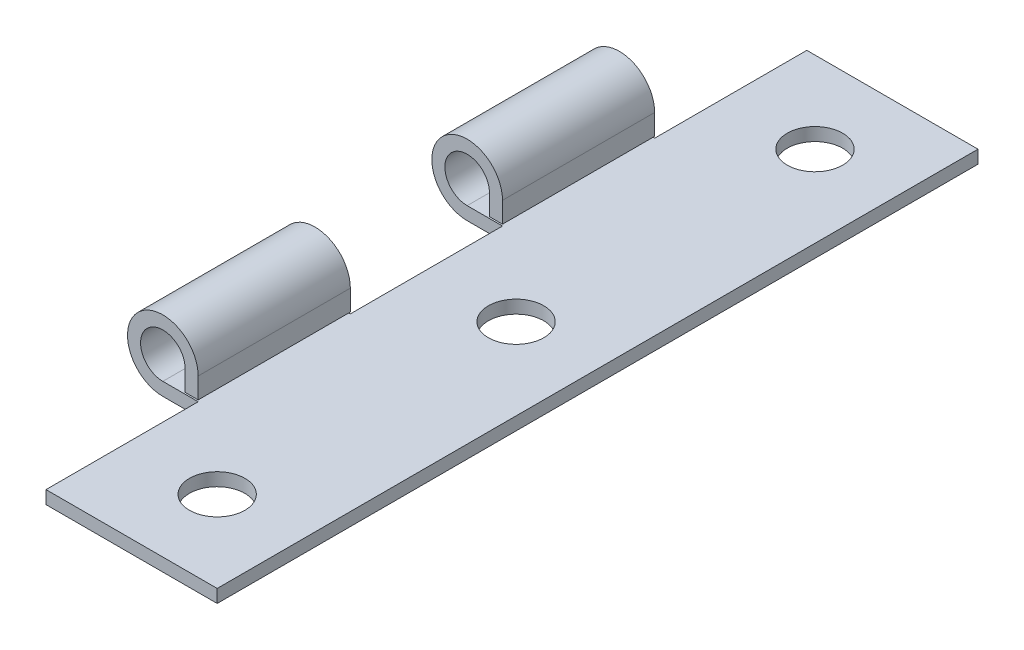
ISO-10303-21;
HEADER;
FILE_DESCRIPTION(('STEP AP214'),'2;1');
FILE_NAME('part.step','',(''),(''),'','','');
FILE_SCHEMA(('AUTOMOTIVE_DESIGN { 1 0 10303 214 1 1 1 1 }'));
ENDSEC;
DATA;
#1=APPLICATION_CONTEXT('core data for automotive mechanical design processes');
#2=APPLICATION_PROTOCOL_DEFINITION('international standard','automotive_design',2000,#1);
#3=PRODUCT_CONTEXT('',#1,'mechanical');
#4=PRODUCT('Part','Part','',(#3));
#5=PRODUCT_RELATED_PRODUCT_CATEGORY('part','',(#4));
#6=PRODUCT_DEFINITION_FORMATION('','',#4);
#7=PRODUCT_DEFINITION_CONTEXT('part definition',#1,'design');
#8=PRODUCT_DEFINITION('design','',#6,#7);
#9=PRODUCT_DEFINITION_SHAPE('','',#8);
#10=(LENGTH_UNIT() NAMED_UNIT(*) SI_UNIT(.MILLI.,.METRE.));
#11=(NAMED_UNIT(*) PLANE_ANGLE_UNIT() SI_UNIT($,.RADIAN.));
#12=(NAMED_UNIT(*) SI_UNIT($,.STERADIAN.) SOLID_ANGLE_UNIT());
#13=UNCERTAINTY_MEASURE_WITH_UNIT(LENGTH_MEASURE(1.E-05),#10,'distance_accuracy_value','');
#14=(GEOMETRIC_REPRESENTATION_CONTEXT(3) GLOBAL_UNCERTAINTY_ASSIGNED_CONTEXT((#13)) GLOBAL_UNIT_ASSIGNED_CONTEXT((#10,
#11,#12)) REPRESENTATION_CONTEXT('',''));
#15=CARTESIAN_POINT('',(0.,0.,0.));
#16=DIRECTION('',(0.,0.,1.));
#17=DIRECTION('',(1.,0.,0.));
#18=AXIS2_PLACEMENT_3D('',#15,#16,#17);
#19=CARTESIAN_POINT('',(0.,-1.2,0.));
#20=DIRECTION('',(-1.,0.,0.));
#21=DIRECTION('',(0.,0.,1.));
#22=AXIS2_PLACEMENT_3D('',#19,#20,#21);
#23=PLANE('',#22);
#24=DIRECTION('',(0.,0.,1.));
#25=VECTOR('',#24,1.);
#26=CARTESIAN_POINT('',(0.,0.,0.));
#27=LINE('',#26,#25);
#28=CARTESIAN_POINT('',(0.,0.,-14.));
#29=VERTEX_POINT('',#28);
#30=CARTESIAN_POINT('',(0.,0.,0.));
#31=VERTEX_POINT('',#30);
#32=EDGE_CURVE('E155',#29,#31,#27,.T.);
#33=ORIENTED_EDGE('',*,*,#32,.F.);
#34=DIRECTION('',(0.,1.,0.));
#35=VECTOR('',#34,1.);
#36=CARTESIAN_POINT('',(0.,-1.2,-14.));
#37=LINE('',#36,#35);
#38=CARTESIAN_POINT('',(0.,-1.2,-14.));
#39=VERTEX_POINT('',#38);
#40=EDGE_CURVE('E11',#39,#29,#37,.T.);
#41=ORIENTED_EDGE('',*,*,#40,.F.);
#42=DIRECTION('',(0.,0.,1.));
#43=VECTOR('',#42,1.);
#44=CARTESIAN_POINT('',(0.,-1.2,0.));
#45=LINE('',#44,#43);
#46=CARTESIAN_POINT('',(0.,-1.2,0.));
#47=VERTEX_POINT('',#46);
#48=EDGE_CURVE('E182',#39,#47,#45,.T.);
#49=ORIENTED_EDGE('',*,*,#48,.T.);
#50=DIRECTION('',(0.,1.,0.));
#51=VECTOR('',#50,1.);
#52=CARTESIAN_POINT('',(0.,-1.2,0.));
#53=LINE('',#52,#51);
#54=EDGE_CURVE('E46',#47,#31,#53,.T.);
#55=ORIENTED_EDGE('',*,*,#54,.T.);
#56=EDGE_LOOP('',(#33,#41,#49,#55));
#57=FACE_BOUND('',#56,.T.);
#58=ADVANCED_FACE('F43',(#57),#23,.T.);
#59=CARTESIAN_POINT('',(0.,-1.2,-14.));
#60=DIRECTION('',(0.,0.,1.));
#61=DIRECTION('',(1.,0.,0.));
#62=AXIS2_PLACEMENT_3D('',#59,#60,#61);
#63=PLANE('',#62);
#64=DIRECTION('',(1.,0.,0.));
#65=VECTOR('',#64,1.);
#66=CARTESIAN_POINT('',(0.,0.,-14.));
#67=LINE('',#66,#65);
#68=CARTESIAN_POINT('',(-3.25,0.,-14.));
#69=VERTEX_POINT('',#68);
#70=EDGE_CURVE('E180',#69,#29,#67,.T.);
#71=ORIENTED_EDGE('',*,*,#70,.F.);
#72=CARTESIAN_POINT('',(-3.25,2.05,-14.));
#73=DIRECTION('',(0.,0.,1.));
#74=DIRECTION('',(1.,0.,0.));
#75=AXIS2_PLACEMENT_3D('',#72,#73,#74);
#76=CIRCLE('',#75,2.05);
#77=CARTESIAN_POINT('',(-1.2,2.05,-14.));
#78=VERTEX_POINT('',#77);
#79=EDGE_CURVE('E204',#78,#69,#76,.T.);
#80=ORIENTED_EDGE('',*,*,#79,.F.);
#81=DIRECTION('',(0.,-1.,0.));
#82=VECTOR('',#81,1.);
#83=CARTESIAN_POINT('',(-1.2,0.,-14.));
#84=LINE('',#83,#82);
#85=CARTESIAN_POINT('',(-1.2,0.145614192675676,-14.));
#86=VERTEX_POINT('',#85);
#87=EDGE_CURVE('E338',#78,#86,#84,.T.);
#88=ORIENTED_EDGE('',*,*,#87,.T.);
#89=DIRECTION('',(1.,0.,0.));
#90=VECTOR('',#89,1.);
#91=CARTESIAN_POINT('',(0.,0.145614192675676,-14.));
#92=LINE('',#91,#90);
#93=CARTESIAN_POINT('',(0.,0.145614192675676,-14.));
#94=VERTEX_POINT('',#93);
#95=EDGE_CURVE('E344',#86,#94,#92,.T.);
#96=ORIENTED_EDGE('',*,*,#95,.T.);
#97=DIRECTION('',(-5.76993793885525E-08,0.999999999999998,0.));
#98=VECTOR('',#97,1.);
#99=CARTESIAN_POINT('',(8.40184854755158E-09,0.,-14.));
#100=LINE('',#99,#98);
#101=CARTESIAN_POINT('',(-1.09881879198981E-07,2.05,-14.));
#102=VERTEX_POINT('',#101);
#103=EDGE_CURVE('E334',#94,#102,#100,.T.);
#104=ORIENTED_EDGE('',*,*,#103,.T.);
#105=CARTESIAN_POINT('',(-3.25,2.05,-14.));
#106=DIRECTION('',(0.,0.,1.));
#107=DIRECTION('',(1.,0.,0.));
#108=AXIS2_PLACEMENT_3D('',#105,#106,#107);
#109=CIRCLE('',#108,3.25);
#110=CARTESIAN_POINT('',(-3.25,-1.2,-14.));
#111=VERTEX_POINT('',#110);
#112=EDGE_CURVE('E331',#102,#111,#109,.T.);
#113=ORIENTED_EDGE('',*,*,#112,.T.);
#114=DIRECTION('',(1.,0.,0.));
#115=VECTOR('',#114,1.);
#116=CARTESIAN_POINT('',(0.,-1.2,-14.));
#117=LINE('',#116,#115);
#118=EDGE_CURVE('E153',#111,#39,#117,.T.);
#119=ORIENTED_EDGE('',*,*,#118,.T.);
#120=ORIENTED_EDGE('',*,*,#40,.T.);
#121=EDGE_LOOP('',(#71,#80,#88,#96,#104,#113,#119,#120));
#122=FACE_BOUND('',#121,.T.);
#123=ADVANCED_FACE('F201',(#122),#63,.T.);
#124=CARTESIAN_POINT('',(0.,-1.2,-28.));
#125=DIRECTION('',(0.,0.,-1.));
#126=DIRECTION('',(-1.,0.,0.));
#127=AXIS2_PLACEMENT_3D('',#124,#125,#126);
#128=PLANE('',#127);
#129=DIRECTION('',(-1.,0.,0.));
#130=VECTOR('',#129,1.);
#131=CARTESIAN_POINT('',(0.,0.,-28.));
#132=LINE('',#131,#130);
#133=CARTESIAN_POINT('',(0.,0.,-28.));
#134=VERTEX_POINT('',#133);
#135=CARTESIAN_POINT('',(-3.25,0.,-28.));
#136=VERTEX_POINT('',#135);
#137=EDGE_CURVE('E177',#134,#136,#132,.T.);
#138=ORIENTED_EDGE('',*,*,#137,.F.);
#139=DIRECTION('',(0.,1.,0.));
#140=VECTOR('',#139,1.);
#141=CARTESIAN_POINT('',(0.,-1.2,-28.));
#142=LINE('',#141,#140);
#143=CARTESIAN_POINT('',(0.,-1.2,-28.));
#144=VERTEX_POINT('',#143);
#145=EDGE_CURVE('E52',#144,#134,#142,.T.);
#146=ORIENTED_EDGE('',*,*,#145,.F.);
#147=DIRECTION('',(-1.,0.,0.));
#148=VECTOR('',#147,1.);
#149=CARTESIAN_POINT('',(0.,-1.2,-28.));
#150=LINE('',#149,#148);
#151=CARTESIAN_POINT('',(-3.25,-1.2,-28.));
#152=VERTEX_POINT('',#151);
#153=EDGE_CURVE('E138',#144,#152,#150,.T.);
#154=ORIENTED_EDGE('',*,*,#153,.T.);
#155=CARTESIAN_POINT('',(-3.25,2.05,-28.));
#156=DIRECTION('',(0.,0.,1.));
#157=DIRECTION('',(1.,0.,0.));
#158=AXIS2_PLACEMENT_3D('',#155,#156,#157);
#159=CIRCLE('',#158,3.25);
#160=CARTESIAN_POINT('',(-1.09881879198981E-07,2.05,-28.));
#161=VERTEX_POINT('',#160);
#162=EDGE_CURVE('E397',#161,#152,#159,.T.);
#163=ORIENTED_EDGE('',*,*,#162,.F.);
#164=DIRECTION('',(-5.76993793885525E-08,0.999999999999998,0.));
#165=VECTOR('',#164,1.);
#166=CARTESIAN_POINT('',(8.40184854755158E-09,0.,-28.));
#167=LINE('',#166,#165);
#168=CARTESIAN_POINT('',(0.,0.145614192675676,-28.));
#169=VERTEX_POINT('',#168);
#170=EDGE_CURVE('E346',#169,#161,#167,.T.);
#171=ORIENTED_EDGE('',*,*,#170,.F.);
#172=DIRECTION('',(1.,0.,0.));
#173=VECTOR('',#172,1.);
#174=CARTESIAN_POINT('',(0.,0.145614192675676,-28.));
#175=LINE('',#174,#173);
#176=CARTESIAN_POINT('',(-1.2,0.145614192675676,-28.));
#177=VERTEX_POINT('',#176);
#178=EDGE_CURVE('E360',#177,#169,#175,.T.);
#179=ORIENTED_EDGE('',*,*,#178,.F.);
#180=DIRECTION('',(0.,-1.,0.));
#181=VECTOR('',#180,1.);
#182=CARTESIAN_POINT('',(-1.2,0.,-28.));
#183=LINE('',#182,#181);
#184=CARTESIAN_POINT('',(-1.2,2.05,-28.));
#185=VERTEX_POINT('',#184);
#186=EDGE_CURVE('E395',#185,#177,#183,.T.);
#187=ORIENTED_EDGE('',*,*,#186,.F.);
#188=CARTESIAN_POINT('',(-3.25,2.05,-28.));
#189=DIRECTION('',(0.,0.,1.));
#190=DIRECTION('',(1.,0.,0.));
#191=AXIS2_PLACEMENT_3D('',#188,#189,#190);
#192=CIRCLE('',#191,2.05);
#193=EDGE_CURVE('E391',#185,#136,#192,.T.);
#194=ORIENTED_EDGE('',*,*,#193,.T.);
#195=EDGE_LOOP('',(#138,#146,#154,#163,#171,#179,#187,#194));
#196=FACE_BOUND('',#195,.T.);
#197=ADVANCED_FACE('F392',(#196),#128,.T.);
#198=CARTESIAN_POINT('',(0.,-1.2,-28.));
#199=DIRECTION('',(-1.,0.,0.));
#200=DIRECTION('',(0.,0.,1.));
#201=AXIS2_PLACEMENT_3D('',#198,#199,#200);
#202=PLANE('',#201);
#203=DIRECTION('',(0.,0.,1.));
#204=VECTOR('',#203,1.);
#205=CARTESIAN_POINT('',(0.,0.,-28.));
#206=LINE('',#205,#204);
#207=CARTESIAN_POINT('',(0.,0.,-42.));
#208=VERTEX_POINT('',#207);
#209=EDGE_CURVE('E121',#208,#134,#206,.T.);
#210=ORIENTED_EDGE('',*,*,#209,.F.);
#211=DIRECTION('',(0.,1.,0.));
#212=VECTOR('',#211,1.);
#213=CARTESIAN_POINT('',(0.,-1.2,-42.));
#214=LINE('',#213,#212);
#215=CARTESIAN_POINT('',(0.,-1.2,-42.));
#216=VERTEX_POINT('',#215);
#217=EDGE_CURVE('E116',#216,#208,#214,.T.);
#218=ORIENTED_EDGE('',*,*,#217,.F.);
#219=DIRECTION('',(0.,0.,1.));
#220=VECTOR('',#219,1.);
#221=CARTESIAN_POINT('',(0.,-1.2,-28.));
#222=LINE('',#221,#220);
#223=EDGE_CURVE('E119',#216,#144,#222,.T.);
#224=ORIENTED_EDGE('',*,*,#223,.T.);
#225=ORIENTED_EDGE('',*,*,#145,.T.);
#226=EDGE_LOOP('',(#210,#218,#224,#225));
#227=FACE_BOUND('',#226,.T.);
#228=ADVANCED_FACE('F118',(#227),#202,.T.);
#229=CARTESIAN_POINT('',(0.,-1.2,-42.));
#230=DIRECTION('',(0.,0.,1.));
#231=DIRECTION('',(1.,0.,0.));
#232=AXIS2_PLACEMENT_3D('',#229,#230,#231);
#233=PLANE('',#232);
#234=DIRECTION('',(1.,0.,0.));
#235=VECTOR('',#234,1.);
#236=CARTESIAN_POINT('',(0.,0.,-42.));
#237=LINE('',#236,#235);
#238=CARTESIAN_POINT('',(-3.25,0.,-42.));
#239=VERTEX_POINT('',#238);
#240=EDGE_CURVE('E174',#239,#208,#237,.T.);
#241=ORIENTED_EDGE('',*,*,#240,.F.);
#242=CARTESIAN_POINT('',(-3.25,2.05,-42.));
#243=DIRECTION('',(0.,0.,-1.));
#244=DIRECTION('',(1.,0.,0.));
#245=AXIS2_PLACEMENT_3D('',#242,#243,#244);
#246=CIRCLE('',#245,2.05);
#247=CARTESIAN_POINT('',(-1.2,2.05,-42.));
#248=VERTEX_POINT('',#247);
#249=EDGE_CURVE('E349',#239,#248,#246,.T.);
#250=ORIENTED_EDGE('',*,*,#249,.T.);
#251=DIRECTION('',(0.,-1.,0.));
#252=VECTOR('',#251,1.);
#253=CARTESIAN_POINT('',(-1.2,2.05,-42.));
#254=LINE('',#253,#252);
#255=CARTESIAN_POINT('',(-1.2,0.145614192675676,-42.));
#256=VERTEX_POINT('',#255);
#257=EDGE_CURVE('E365',#248,#256,#254,.T.);
#258=ORIENTED_EDGE('',*,*,#257,.T.);
#259=DIRECTION('',(1.,0.,0.));
#260=VECTOR('',#259,1.);
#261=CARTESIAN_POINT('',(-1.2,0.145614192675676,-42.));
#262=LINE('',#261,#260);
#263=CARTESIAN_POINT('',(0.,0.145614192675676,-42.));
#264=VERTEX_POINT('',#263);
#265=EDGE_CURVE('E363',#256,#264,#262,.T.);
#266=ORIENTED_EDGE('',*,*,#265,.T.);
#267=DIRECTION('',(0.,1.,0.));
#268=VECTOR('',#267,1.);
#269=CARTESIAN_POINT('',(0.,2.05,-42.));
#270=LINE('',#269,#268);
#271=CARTESIAN_POINT('',(0.,2.05,-42.));
#272=VERTEX_POINT('',#271);
#273=EDGE_CURVE('E267',#264,#272,#270,.T.);
#274=ORIENTED_EDGE('',*,*,#273,.T.);
#275=CARTESIAN_POINT('',(-3.25,2.05,-42.));
#276=DIRECTION('',(0.,0.,1.));
#277=DIRECTION('',(1.,0.,0.));
#278=AXIS2_PLACEMENT_3D('',#275,#276,#277);
#279=CIRCLE('',#278,3.25);
#280=CARTESIAN_POINT('',(-3.25,-1.2,-42.));
#281=VERTEX_POINT('',#280);
#282=EDGE_CURVE('E144',#272,#281,#279,.T.);
#283=ORIENTED_EDGE('',*,*,#282,.T.);
#284=DIRECTION('',(1.,0.,0.));
#285=VECTOR('',#284,1.);
#286=CARTESIAN_POINT('',(0.,-1.2,-42.));
#287=LINE('',#286,#285);
#288=EDGE_CURVE('E134',#281,#216,#287,.T.);
#289=ORIENTED_EDGE('',*,*,#288,.T.);
#290=ORIENTED_EDGE('',*,*,#217,.T.);
#291=EDGE_LOOP('',(#241,#250,#258,#266,#274,#283,#289,#290));
#292=FACE_BOUND('',#291,.T.);
#293=ADVANCED_FACE('F141',(#292),#233,.T.);
#294=CARTESIAN_POINT('',(0.,-1.2,-56.));
#295=DIRECTION('',(0.,0.,-1.));
#296=DIRECTION('',(-1.,0.,0.));
#297=AXIS2_PLACEMENT_3D('',#294,#295,#296);
#298=PLANE('',#297);
#299=DIRECTION('',(-1.,0.,0.));
#300=VECTOR('',#299,1.);
#301=CARTESIAN_POINT('',(0.,0.,-56.));
#302=LINE('',#301,#300);
#303=CARTESIAN_POINT('',(0.,0.,-56.));
#304=VERTEX_POINT('',#303);
#305=CARTESIAN_POINT('',(-3.25,0.,-56.));
#306=VERTEX_POINT('',#305);
#307=EDGE_CURVE('E171',#304,#306,#302,.T.);
#308=ORIENTED_EDGE('',*,*,#307,.F.);
#309=DIRECTION('',(0.,1.,0.));
#310=VECTOR('',#309,1.);
#311=CARTESIAN_POINT('',(0.,-1.2,-56.));
#312=LINE('',#311,#310);
#313=CARTESIAN_POINT('',(0.,-1.2,-56.));
#314=VERTEX_POINT('',#313);
#315=EDGE_CURVE('E126',#314,#304,#312,.T.);
#316=ORIENTED_EDGE('',*,*,#315,.F.);
#317=DIRECTION('',(-1.,0.,0.));
#318=VECTOR('',#317,1.);
#319=CARTESIAN_POINT('',(0.,-1.2,-56.));
#320=LINE('',#319,#318);
#321=CARTESIAN_POINT('',(-3.25,-1.2,-56.));
#322=VERTEX_POINT('',#321);
#323=EDGE_CURVE('E145',#314,#322,#320,.T.);
#324=ORIENTED_EDGE('',*,*,#323,.T.);
#325=CARTESIAN_POINT('',(-3.25,2.05,-56.));
#326=DIRECTION('',(0.,0.,-1.));
#327=DIRECTION('',(-1.,0.,0.));
#328=AXIS2_PLACEMENT_3D('',#325,#326,#327);
#329=CIRCLE('',#328,3.25);
#330=CARTESIAN_POINT('',(0.,2.05,-56.));
#331=VERTEX_POINT('',#330);
#332=EDGE_CURVE('E259',#331,#322,#329,.F.);
#333=ORIENTED_EDGE('',*,*,#332,.F.);
#334=DIRECTION('',(0.,1.,0.));
#335=VECTOR('',#334,1.);
#336=CARTESIAN_POINT('',(0.,2.05,-56.));
#337=LINE('',#336,#335);
#338=CARTESIAN_POINT('',(0.,0.145614192675676,-56.));
#339=VERTEX_POINT('',#338);
#340=EDGE_CURVE('E250',#339,#331,#337,.T.);
#341=ORIENTED_EDGE('',*,*,#340,.F.);
#342=DIRECTION('',(1.,0.,0.));
#343=VECTOR('',#342,1.);
#344=CARTESIAN_POINT('',(-1.2,0.145614192675676,-56.));
#345=LINE('',#344,#343);
#346=CARTESIAN_POINT('',(-1.2,0.145614192675676,-56.));
#347=VERTEX_POINT('',#346);
#348=EDGE_CURVE('E256',#347,#339,#345,.T.);
#349=ORIENTED_EDGE('',*,*,#348,.F.);
#350=DIRECTION('',(0.,-1.,0.));
#351=VECTOR('',#350,1.);
#352=CARTESIAN_POINT('',(-1.2,2.05,-56.));
#353=LINE('',#352,#351);
#354=CARTESIAN_POINT('',(-1.2,2.05,-56.));
#355=VERTEX_POINT('',#354);
#356=EDGE_CURVE('E276',#355,#347,#353,.T.);
#357=ORIENTED_EDGE('',*,*,#356,.F.);
#358=CARTESIAN_POINT('',(-3.25,2.05,-56.));
#359=DIRECTION('',(0.,0.,-1.));
#360=DIRECTION('',(-1.,0.,0.));
#361=AXIS2_PLACEMENT_3D('',#358,#359,#360);
#362=CIRCLE('',#361,2.05);
#363=EDGE_CURVE('E283',#306,#355,#362,.T.);
#364=ORIENTED_EDGE('',*,*,#363,.F.);
#365=EDGE_LOOP('',(#308,#316,#324,#333,#341,#349,#357,#364));
#366=FACE_BOUND('',#365,.T.);
#367=ADVANCED_FACE('F253',(#366),#298,.T.);
#368=CARTESIAN_POINT('',(0.,-1.2,-56.));
#369=DIRECTION('',(-1.,0.,0.));
#370=DIRECTION('',(0.,0.,1.));
#371=AXIS2_PLACEMENT_3D('',#368,#369,#370);
#372=PLANE('',#371);
#373=DIRECTION('',(0.,0.,1.));
#374=VECTOR('',#373,1.);
#375=CARTESIAN_POINT('',(0.,0.,-56.));
#376=LINE('',#375,#374);
#377=CARTESIAN_POINT('',(0.,0.,-70.));
#378=VERTEX_POINT('',#377);
#379=EDGE_CURVE('E168',#378,#304,#376,.T.);
#380=ORIENTED_EDGE('',*,*,#379,.F.);
#381=DIRECTION('',(0.,1.,0.));
#382=VECTOR('',#381,1.);
#383=CARTESIAN_POINT('',(0.,-1.2,-70.));
#384=LINE('',#383,#382);
#385=CARTESIAN_POINT('',(0.,-1.2,-70.));
#386=VERTEX_POINT('',#385);
#387=EDGE_CURVE('E186',#386,#378,#384,.T.);
#388=ORIENTED_EDGE('',*,*,#387,.F.);
#389=DIRECTION('',(0.,0.,1.));
#390=VECTOR('',#389,1.);
#391=CARTESIAN_POINT('',(0.,-1.2,-56.));
#392=LINE('',#391,#390);
#393=EDGE_CURVE('E148',#386,#314,#392,.T.);
#394=ORIENTED_EDGE('',*,*,#393,.T.);
#395=ORIENTED_EDGE('',*,*,#315,.T.);
#396=EDGE_LOOP('',(#380,#388,#394,#395));
#397=FACE_BOUND('',#396,.T.);
#398=ADVANCED_FACE('F318',(#397),#372,.T.);
#399=CARTESIAN_POINT('',(0.,-1.2,-70.));
#400=DIRECTION('',(0.,0.,-1.));
#401=DIRECTION('',(-1.,0.,0.));
#402=AXIS2_PLACEMENT_3D('',#399,#400,#401);
#403=PLANE('',#402);
#404=DIRECTION('',(-1.,0.,0.));
#405=VECTOR('',#404,1.);
#406=CARTESIAN_POINT('',(0.,0.,-70.));
#407=LINE('',#406,#405);
#408=CARTESIAN_POINT('',(15.75,0.,-70.));
#409=VERTEX_POINT('',#408);
#410=EDGE_CURVE('E165',#409,#378,#407,.T.);
#411=ORIENTED_EDGE('',*,*,#410,.F.);
#412=DIRECTION('',(0.,1.,0.));
#413=VECTOR('',#412,1.);
#414=CARTESIAN_POINT('',(15.75,-1.2,-70.));
#415=LINE('',#414,#413);
#416=CARTESIAN_POINT('',(15.75,-1.2,-70.));
#417=VERTEX_POINT('',#416);
#418=EDGE_CURVE('E188',#417,#409,#415,.T.);
#419=ORIENTED_EDGE('',*,*,#418,.F.);
#420=DIRECTION('',(-1.,0.,0.));
#421=VECTOR('',#420,1.);
#422=CARTESIAN_POINT('',(0.,-1.2,-70.));
#423=LINE('',#422,#421);
#424=EDGE_CURVE('E312',#417,#386,#423,.T.);
#425=ORIENTED_EDGE('',*,*,#424,.T.);
#426=ORIENTED_EDGE('',*,*,#387,.T.);
#427=EDGE_LOOP('',(#411,#419,#425,#426));
#428=FACE_BOUND('',#427,.T.);
#429=ADVANCED_FACE('F324',(#428),#403,.T.);
#430=CARTESIAN_POINT('',(15.75,-1.2,0.));
#431=DIRECTION('',(1.,0.,0.));
#432=DIRECTION('',(0.,0.,-1.));
#433=AXIS2_PLACEMENT_3D('',#430,#431,#432);
#434=PLANE('',#433);
#435=DIRECTION('',(0.,0.,-1.));
#436=VECTOR('',#435,1.);
#437=CARTESIAN_POINT('',(15.75,0.,0.));
#438=LINE('',#437,#436);
#439=CARTESIAN_POINT('',(15.75,0.,0.));
#440=VERTEX_POINT('',#439);
#441=EDGE_CURVE('E162',#440,#409,#438,.T.);
#442=ORIENTED_EDGE('',*,*,#441,.F.);
#443=DIRECTION('',(0.,1.,0.));
#444=VECTOR('',#443,1.);
#445=CARTESIAN_POINT('',(15.75,-1.2,0.));
#446=LINE('',#445,#444);
#447=CARTESIAN_POINT('',(15.75,-1.2,0.));
#448=VERTEX_POINT('',#447);
#449=EDGE_CURVE('E189',#448,#440,#446,.T.);
#450=ORIENTED_EDGE('',*,*,#449,.F.);
#451=DIRECTION('',(0.,0.,-1.));
#452=VECTOR('',#451,1.);
#453=CARTESIAN_POINT('',(15.75,-1.2,0.));
#454=LINE('',#453,#452);
#455=EDGE_CURVE('E309',#448,#417,#454,.T.);
#456=ORIENTED_EDGE('',*,*,#455,.T.);
#457=ORIENTED_EDGE('',*,*,#418,.T.);
#458=EDGE_LOOP('',(#442,#450,#456,#457));
#459=FACE_BOUND('',#458,.T.);
#460=ADVANCED_FACE('F326',(#459),#434,.T.);
#461=CARTESIAN_POINT('',(0.,-1.2,0.));
#462=DIRECTION('',(0.,0.,1.));
#463=DIRECTION('',(1.,0.,0.));
#464=AXIS2_PLACEMENT_3D('',#461,#462,#463);
#465=PLANE('',#464);
#466=DIRECTION('',(1.,0.,0.));
#467=VECTOR('',#466,1.);
#468=CARTESIAN_POINT('',(0.,0.,0.));
#469=LINE('',#468,#467);
#470=EDGE_CURVE('E158',#31,#440,#469,.T.);
#471=ORIENTED_EDGE('',*,*,#470,.F.);
#472=ORIENTED_EDGE('',*,*,#54,.F.);
#473=DIRECTION('',(1.,0.,0.));
#474=VECTOR('',#473,1.);
#475=CARTESIAN_POINT('',(0.,-1.2,0.));
#476=LINE('',#475,#474);
#477=EDGE_CURVE('E307',#47,#448,#476,.T.);
#478=ORIENTED_EDGE('',*,*,#477,.T.);
#479=ORIENTED_EDGE('',*,*,#449,.T.);
#480=EDGE_LOOP('',(#471,#472,#478,#479));
#481=FACE_BOUND('',#480,.T.);
#482=ADVANCED_FACE('F191',(#481),#465,.T.);
#483=CARTESIAN_POINT('',(0.,-1.2,0.));
#484=DIRECTION('',(0.,1.,0.));
#485=DIRECTION('',(0.,0.,1.));
#486=AXIS2_PLACEMENT_3D('',#483,#484,#485);
#487=PLANE('',#486);
#488=CARTESIAN_POINT('',(8.25,-1.2,-7.5));
#489=DIRECTION('',(0.,1.,0.));
#490=DIRECTION('',(0.,0.,1.));
#491=AXIS2_PLACEMENT_3D('',#488,#489,#490);
#492=CIRCLE('',#491,2.55);
#493=CARTESIAN_POINT('',(8.25,-1.2,-4.95));
#494=VERTEX_POINT('',#493);
#495=EDGE_CURVE('E290',#494,#494,#492,.T.);
#496=ORIENTED_EDGE('',*,*,#495,.T.);
#497=EDGE_LOOP('',(#496));
#498=FACE_BOUND('',#497,.T.);
#499=CARTESIAN_POINT('',(8.25,-1.2,-35.));
#500=DIRECTION('',(0.,1.,0.));
#501=DIRECTION('',(0.,0.,1.));
#502=AXIS2_PLACEMENT_3D('',#499,#500,#501);
#503=CIRCLE('',#502,2.55);
#504=CARTESIAN_POINT('',(8.25,-1.2,-32.45));
#505=VERTEX_POINT('',#504);
#506=EDGE_CURVE('E296',#505,#505,#503,.T.);
#507=ORIENTED_EDGE('',*,*,#506,.T.);
#508=EDGE_LOOP('',(#507));
#509=FACE_BOUND('',#508,.T.);
#510=CARTESIAN_POINT('',(8.25,-1.2,-62.5));
#511=DIRECTION('',(0.,1.,0.));
#512=DIRECTION('',(0.,0.,1.));
#513=AXIS2_PLACEMENT_3D('',#510,#511,#512);
#514=CIRCLE('',#513,2.55);
#515=CARTESIAN_POINT('',(8.25,-1.2,-59.95));
#516=VERTEX_POINT('',#515);
#517=EDGE_CURVE('E159',#516,#516,#514,.T.);
#518=ORIENTED_EDGE('',*,*,#517,.T.);
#519=EDGE_LOOP('',(#518));
#520=FACE_BOUND('',#519,.T.);
#521=ORIENTED_EDGE('',*,*,#223,.F.);
#522=ORIENTED_EDGE('',*,*,#288,.F.);
#523=DIRECTION('',(0.,0.,1.));
#524=VECTOR('',#523,1.);
#525=CARTESIAN_POINT('',(-3.25,-1.2,-65.1923881554251));
#526=LINE('',#525,#524);
#527=EDGE_CURVE('E284',#322,#281,#526,.T.);
#528=ORIENTED_EDGE('',*,*,#527,.F.);
#529=ORIENTED_EDGE('',*,*,#323,.F.);
#530=ORIENTED_EDGE('',*,*,#393,.F.);
#531=ORIENTED_EDGE('',*,*,#424,.F.);
#532=ORIENTED_EDGE('',*,*,#455,.F.);
#533=ORIENTED_EDGE('',*,*,#477,.F.);
#534=ORIENTED_EDGE('',*,*,#48,.F.);
#535=ORIENTED_EDGE('',*,*,#118,.F.);
#536=DIRECTION('',(0.,0.,1.));
#537=VECTOR('',#536,1.);
#538=CARTESIAN_POINT('',(-3.25,-1.2,-28.));
#539=LINE('',#538,#537);
#540=EDGE_CURVE('E355',#152,#111,#539,.T.);
#541=ORIENTED_EDGE('',*,*,#540,.F.);
#542=ORIENTED_EDGE('',*,*,#153,.F.);
#543=EDGE_LOOP('',(#521,#522,#528,#529,#530,#531,#532,#533,#534,#535,#541,#542));
#544=FACE_BOUND('',#543,.T.);
#545=ADVANCED_FACE('F131',(#498,#509,#520,#544),#487,.F.);
#546=CARTESIAN_POINT('',(0.,0.,0.));
#547=DIRECTION('',(0.,1.,0.));
#548=DIRECTION('',(0.,0.,1.));
#549=AXIS2_PLACEMENT_3D('',#546,#547,#548);
#550=PLANE('',#549);
#551=ORIENTED_EDGE('',*,*,#379,.T.);
#552=ORIENTED_EDGE('',*,*,#307,.T.);
#553=DIRECTION('',(0.,0.,1.));
#554=VECTOR('',#553,1.);
#555=CARTESIAN_POINT('',(-3.25,0.,-65.1923881554251));
#556=LINE('',#555,#554);
#557=EDGE_CURVE('E280',#306,#239,#556,.T.);
#558=ORIENTED_EDGE('',*,*,#557,.T.);
#559=ORIENTED_EDGE('',*,*,#240,.T.);
#560=ORIENTED_EDGE('',*,*,#209,.T.);
#561=ORIENTED_EDGE('',*,*,#137,.T.);
#562=DIRECTION('',(0.,0.,1.));
#563=VECTOR('',#562,1.);
#564=CARTESIAN_POINT('',(-3.25,0.,-28.));
#565=LINE('',#564,#563);
#566=EDGE_CURVE('E198',#136,#69,#565,.T.);
#567=ORIENTED_EDGE('',*,*,#566,.T.);
#568=ORIENTED_EDGE('',*,*,#70,.T.);
#569=ORIENTED_EDGE('',*,*,#32,.T.);
#570=ORIENTED_EDGE('',*,*,#470,.T.);
#571=ORIENTED_EDGE('',*,*,#441,.T.);
#572=ORIENTED_EDGE('',*,*,#410,.T.);
#573=EDGE_LOOP('',(#551,#552,#558,#559,#560,#561,#567,#568,#569,#570,#571,#572));
#574=FACE_BOUND('',#573,.T.);
#575=CARTESIAN_POINT('',(8.25,0.,-7.5));
#576=DIRECTION('',(0.,1.,0.));
#577=DIRECTION('',(0.,0.,1.));
#578=AXIS2_PLACEMENT_3D('',#575,#576,#577);
#579=CIRCLE('',#578,2.55);
#580=CARTESIAN_POINT('',(8.25,0.,-4.95));
#581=VERTEX_POINT('',#580);
#582=EDGE_CURVE('E289',#581,#581,#579,.T.);
#583=ORIENTED_EDGE('',*,*,#582,.F.);
#584=EDGE_LOOP('',(#583));
#585=FACE_BOUND('',#584,.T.);
#586=CARTESIAN_POINT('',(8.25,0.,-35.));
#587=DIRECTION('',(0.,1.,0.));
#588=DIRECTION('',(0.,0.,1.));
#589=AXIS2_PLACEMENT_3D('',#586,#587,#588);
#590=CIRCLE('',#589,2.55);
#591=CARTESIAN_POINT('',(8.25,0.,-32.45));
#592=VERTEX_POINT('',#591);
#593=EDGE_CURVE('E293',#592,#592,#590,.T.);
#594=ORIENTED_EDGE('',*,*,#593,.F.);
#595=EDGE_LOOP('',(#594));
#596=FACE_BOUND('',#595,.T.);
#597=CARTESIAN_POINT('',(8.25,0.,-62.5));
#598=DIRECTION('',(0.,1.,0.));
#599=DIRECTION('',(0.,0.,1.));
#600=AXIS2_PLACEMENT_3D('',#597,#598,#599);
#601=CIRCLE('',#600,2.55);
#602=CARTESIAN_POINT('',(8.25,0.,-59.95));
#603=VERTEX_POINT('',#602);
#604=EDGE_CURVE('E299',#603,#603,#601,.T.);
#605=ORIENTED_EDGE('',*,*,#604,.F.);
#606=EDGE_LOOP('',(#605));
#607=FACE_BOUND('',#606,.T.);
#608=ADVANCED_FACE('F193',(#574,#585,#596,#607),#550,.T.);
#609=CARTESIAN_POINT('',(8.25,-1.2,-62.5));
#610=DIRECTION('',(0.,1.,0.));
#611=DIRECTION('',(0.,0.,1.));
#612=AXIS2_PLACEMENT_3D('',#609,#610,#611);
#613=CYLINDRICAL_SURFACE('',#612,2.55);
#614=ORIENTED_EDGE('',*,*,#517,.F.);
#615=EDGE_LOOP('',(#614));
#616=FACE_BOUND('',#615,.T.);
#617=ORIENTED_EDGE('',*,*,#604,.T.);
#618=EDGE_LOOP('',(#617));
#619=FACE_BOUND('',#618,.T.);
#620=ADVANCED_FACE('F464',(#616,#619),#613,.F.);
#621=CARTESIAN_POINT('',(8.25,-1.2,-35.));
#622=DIRECTION('',(0.,1.,0.));
#623=DIRECTION('',(0.,0.,1.));
#624=AXIS2_PLACEMENT_3D('',#621,#622,#623);
#625=CYLINDRICAL_SURFACE('',#624,2.55);
#626=ORIENTED_EDGE('',*,*,#506,.F.);
#627=EDGE_LOOP('',(#626));
#628=FACE_BOUND('',#627,.T.);
#629=ORIENTED_EDGE('',*,*,#593,.T.);
#630=EDGE_LOOP('',(#629));
#631=FACE_BOUND('',#630,.T.);
#632=ADVANCED_FACE('F469',(#628,#631),#625,.F.);
#633=CARTESIAN_POINT('',(8.25,-1.2,-7.5));
#634=DIRECTION('',(0.,1.,0.));
#635=DIRECTION('',(0.,0.,1.));
#636=AXIS2_PLACEMENT_3D('',#633,#634,#635);
#637=CYLINDRICAL_SURFACE('',#636,2.55);
#638=ORIENTED_EDGE('',*,*,#495,.F.);
#639=EDGE_LOOP('',(#638));
#640=FACE_BOUND('',#639,.T.);
#641=ORIENTED_EDGE('',*,*,#582,.T.);
#642=EDGE_LOOP('',(#641));
#643=FACE_BOUND('',#642,.T.);
#644=ADVANCED_FACE('F473',(#640,#643),#637,.F.);
#645=CARTESIAN_POINT('',(-1.2,2.05,-65.1923881554251));
#646=DIRECTION('',(-1.,0.,0.));
#647=DIRECTION('',(0.,0.,1.));
#648=AXIS2_PLACEMENT_3D('',#645,#646,#647);
#649=PLANE('',#648);
#650=DIRECTION('',(0.,0.,1.));
#651=VECTOR('',#650,1.);
#652=CARTESIAN_POINT('',(-1.2,2.05,-65.1923881554251));
#653=LINE('',#652,#651);
#654=EDGE_CURVE('E287',#355,#248,#653,.T.);
#655=ORIENTED_EDGE('',*,*,#654,.F.);
#656=ORIENTED_EDGE('',*,*,#356,.T.);
#657=DIRECTION('',(0.,0.,1.));
#658=VECTOR('',#657,1.);
#659=CARTESIAN_POINT('',(-1.2,0.145614192675676,-65.1923881554251));
#660=LINE('',#659,#658);
#661=EDGE_CURVE('E273',#347,#256,#660,.T.);
#662=ORIENTED_EDGE('',*,*,#661,.T.);
#663=ORIENTED_EDGE('',*,*,#257,.F.);
#664=EDGE_LOOP('',(#655,#656,#662,#663));
#665=FACE_BOUND('',#664,.T.);
#666=ADVANCED_FACE('F378',(#665),#649,.T.);
#667=CARTESIAN_POINT('',(-1.2,0.145614192675676,-65.1923881554251));
#668=DIRECTION('',(0.,-1.,0.));
#669=DIRECTION('',(0.,0.,-1.));
#670=AXIS2_PLACEMENT_3D('',#667,#668,#669);
#671=PLANE('',#670);
#672=ORIENTED_EDGE('',*,*,#661,.F.);
#673=ORIENTED_EDGE('',*,*,#348,.T.);
#674=DIRECTION('',(0.,0.,1.));
#675=VECTOR('',#674,1.);
#676=CARTESIAN_POINT('',(0.,0.145614192675676,-65.1923881554251));
#677=LINE('',#676,#675);
#678=EDGE_CURVE('E263',#339,#264,#677,.T.);
#679=ORIENTED_EDGE('',*,*,#678,.T.);
#680=ORIENTED_EDGE('',*,*,#265,.F.);
#681=EDGE_LOOP('',(#672,#673,#679,#680));
#682=FACE_BOUND('',#681,.T.);
#683=ADVANCED_FACE('F272',(#682),#671,.T.);
#684=CARTESIAN_POINT('',(0.,2.05,-65.1923881554251));
#685=DIRECTION('',(1.,0.,0.));
#686=DIRECTION('',(0.,1.,0.));
#687=AXIS2_PLACEMENT_3D('',#684,#685,#686);
#688=PLANE('',#687);
#689=ORIENTED_EDGE('',*,*,#678,.F.);
#690=ORIENTED_EDGE('',*,*,#340,.T.);
#691=DIRECTION('',(0.,0.,1.));
#692=VECTOR('',#691,1.);
#693=CARTESIAN_POINT('',(0.,2.05,-65.1923881554251));
#694=LINE('',#693,#692);
#695=EDGE_CURVE('E262',#331,#272,#694,.T.);
#696=ORIENTED_EDGE('',*,*,#695,.T.);
#697=ORIENTED_EDGE('',*,*,#273,.F.);
#698=EDGE_LOOP('',(#689,#690,#696,#697));
#699=FACE_BOUND('',#698,.T.);
#700=ADVANCED_FACE('F266',(#699),#688,.T.);
#701=CARTESIAN_POINT('',(-3.25,2.05,-65.1923881554251));
#702=DIRECTION('',(0.,0.,1.));
#703=DIRECTION('',(1.,0.,0.));
#704=AXIS2_PLACEMENT_3D('',#701,#702,#703);
#705=CYLINDRICAL_SURFACE('',#704,3.25);
#706=ORIENTED_EDGE('',*,*,#695,.F.);
#707=ORIENTED_EDGE('',*,*,#332,.T.);
#708=ORIENTED_EDGE('',*,*,#527,.T.);
#709=ORIENTED_EDGE('',*,*,#282,.F.);
#710=EDGE_LOOP('',(#706,#707,#708,#709));
#711=FACE_BOUND('',#710,.T.);
#712=ADVANCED_FACE('F373',(#711),#705,.T.);
#713=CARTESIAN_POINT('',(-3.25,2.05,-65.1923881554251));
#714=DIRECTION('',(0.,0.,1.));
#715=DIRECTION('',(1.,0.,0.));
#716=AXIS2_PLACEMENT_3D('',#713,#714,#715);
#717=CYLINDRICAL_SURFACE('',#716,2.05);
#718=ORIENTED_EDGE('',*,*,#557,.F.);
#719=ORIENTED_EDGE('',*,*,#363,.T.);
#720=ORIENTED_EDGE('',*,*,#654,.T.);
#721=ORIENTED_EDGE('',*,*,#249,.F.);
#722=EDGE_LOOP('',(#718,#719,#720,#721));
#723=FACE_BOUND('',#722,.T.);
#724=ADVANCED_FACE('F382',(#723),#717,.F.);
#725=CARTESIAN_POINT('',(8.40184854755158E-09,0.,-28.));
#726=DIRECTION('',(0.999999999999998,5.76993793885525E-08,0.));
#727=DIRECTION('',(-5.76993793885525E-08,0.999999999999998,0.));
#728=AXIS2_PLACEMENT_3D('',#725,#726,#727);
#729=PLANE('',#728);
#730=ORIENTED_EDGE('',*,*,#103,.F.);
#731=DIRECTION('',(0.,0.,1.));
#732=VECTOR('',#731,1.);
#733=CARTESIAN_POINT('',(0.,0.145614192675676,-28.));
#734=LINE('',#733,#732);
#735=EDGE_CURVE('E347',#169,#94,#734,.T.);
#736=ORIENTED_EDGE('',*,*,#735,.F.);
#737=ORIENTED_EDGE('',*,*,#170,.T.);
#738=DIRECTION('',(0.,0.,1.));
#739=VECTOR('',#738,1.);
#740=CARTESIAN_POINT('',(-1.09881879198981E-07,2.05,-28.));
#741=LINE('',#740,#739);
#742=EDGE_CURVE('E357',#161,#102,#741,.T.);
#743=ORIENTED_EDGE('',*,*,#742,.T.);
#744=EDGE_LOOP('',(#730,#736,#737,#743));
#745=FACE_BOUND('',#744,.T.);
#746=ADVANCED_FACE('F412',(#745),#729,.T.);
#747=CARTESIAN_POINT('',(0.,0.145614192675676,-28.));
#748=DIRECTION('',(0.,-1.,0.));
#749=DIRECTION('',(0.,0.,-1.));
#750=AXIS2_PLACEMENT_3D('',#747,#748,#749);
#751=PLANE('',#750);
#752=ORIENTED_EDGE('',*,*,#95,.F.);
#753=DIRECTION('',(0.,0.,1.));
#754=VECTOR('',#753,1.);
#755=CARTESIAN_POINT('',(-1.2,0.145614192675676,-28.));
#756=LINE('',#755,#754);
#757=EDGE_CURVE('E350',#177,#86,#756,.T.);
#758=ORIENTED_EDGE('',*,*,#757,.F.);
#759=ORIENTED_EDGE('',*,*,#178,.T.);
#760=ORIENTED_EDGE('',*,*,#735,.T.);
#761=EDGE_LOOP('',(#752,#758,#759,#760));
#762=FACE_BOUND('',#761,.T.);
#763=ADVANCED_FACE('F424',(#762),#751,.T.);
#764=CARTESIAN_POINT('',(-1.2,0.,-28.));
#765=DIRECTION('',(-1.,0.,0.));
#766=DIRECTION('',(0.,0.,1.));
#767=AXIS2_PLACEMENT_3D('',#764,#765,#766);
#768=PLANE('',#767);
#769=ORIENTED_EDGE('',*,*,#87,.F.);
#770=DIRECTION('',(0.,0.,1.));
#771=VECTOR('',#770,1.);
#772=CARTESIAN_POINT('',(-1.2,2.05,-28.));
#773=LINE('',#772,#771);
#774=EDGE_CURVE('E352',#185,#78,#773,.T.);
#775=ORIENTED_EDGE('',*,*,#774,.F.);
#776=ORIENTED_EDGE('',*,*,#186,.T.);
#777=ORIENTED_EDGE('',*,*,#757,.T.);
#778=EDGE_LOOP('',(#769,#775,#776,#777));
#779=FACE_BOUND('',#778,.T.);
#780=ADVANCED_FACE('F402',(#779),#768,.T.);
#781=CARTESIAN_POINT('',(-3.25,2.05,-28.));
#782=DIRECTION('',(0.,0.,1.));
#783=DIRECTION('',(1.,0.,0.));
#784=AXIS2_PLACEMENT_3D('',#781,#782,#783);
#785=CYLINDRICAL_SURFACE('',#784,2.05);
#786=ORIENTED_EDGE('',*,*,#79,.T.);
#787=ORIENTED_EDGE('',*,*,#566,.F.);
#788=ORIENTED_EDGE('',*,*,#193,.F.);
#789=ORIENTED_EDGE('',*,*,#774,.T.);
#790=EDGE_LOOP('',(#786,#787,#788,#789));
#791=FACE_BOUND('',#790,.T.);
#792=ADVANCED_FACE('F399',(#791),#785,.F.);
#793=CARTESIAN_POINT('',(-3.25,2.05,-28.));
#794=DIRECTION('',(0.,0.,1.));
#795=DIRECTION('',(1.,0.,0.));
#796=AXIS2_PLACEMENT_3D('',#793,#794,#795);
#797=CYLINDRICAL_SURFACE('',#796,3.25);
#798=ORIENTED_EDGE('',*,*,#112,.F.);
#799=ORIENTED_EDGE('',*,*,#742,.F.);
#800=ORIENTED_EDGE('',*,*,#162,.T.);
#801=ORIENTED_EDGE('',*,*,#540,.T.);
#802=EDGE_LOOP('',(#798,#799,#800,#801));
#803=FACE_BOUND('',#802,.T.);
#804=ADVANCED_FACE('F416',(#803),#797,.T.);
#805=CLOSED_SHELL('',(#58,#123,#197,#228,#293,#367,#398,#429,#460,#482,#545,#608,#620,#632,#644,
#666,#683,#700,#712,#724,#746,#763,#780,#792,#804));
#806=MANIFOLD_SOLID_BREP('B2',#805);
#807=ADVANCED_BREP_SHAPE_REPRESENTATION('',(#18,#806),#14);
#808=SHAPE_DEFINITION_REPRESENTATION(#9,#807);
ENDSEC;
END-ISO-10303-21;
